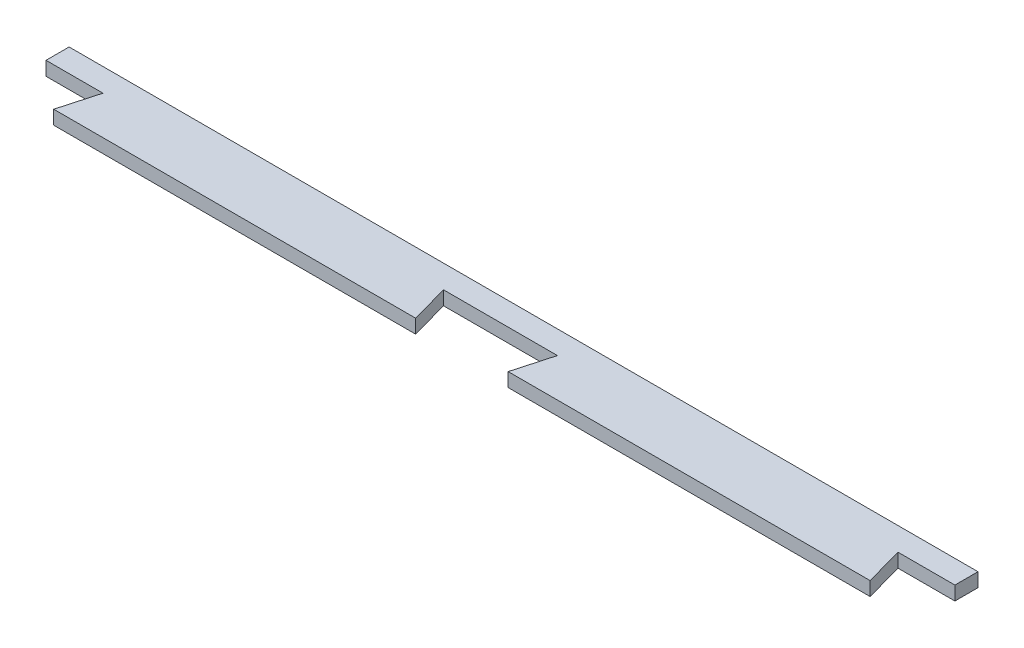
ISO-10303-21;
HEADER;
FILE_DESCRIPTION(('STEP AP214'),'2;1');
FILE_NAME('part.step','',(''),(''),'','','');
FILE_SCHEMA(('AUTOMOTIVE_DESIGN { 1 0 10303 214 1 1 1 1 }'));
ENDSEC;
DATA;
#1=APPLICATION_CONTEXT('core data for automotive mechanical design processes');
#2=APPLICATION_PROTOCOL_DEFINITION('international standard','automotive_design',2000,#1);
#3=PRODUCT_CONTEXT('',#1,'mechanical');
#4=PRODUCT('Part','Part','',(#3));
#5=PRODUCT_RELATED_PRODUCT_CATEGORY('part','',(#4));
#6=PRODUCT_DEFINITION_FORMATION('','',#4);
#7=PRODUCT_DEFINITION_CONTEXT('part definition',#1,'design');
#8=PRODUCT_DEFINITION('design','',#6,#7);
#9=PRODUCT_DEFINITION_SHAPE('','',#8);
#10=(LENGTH_UNIT() NAMED_UNIT(*) SI_UNIT(.MILLI.,.METRE.));
#11=(NAMED_UNIT(*) PLANE_ANGLE_UNIT() SI_UNIT($,.RADIAN.));
#12=(NAMED_UNIT(*) SI_UNIT($,.STERADIAN.) SOLID_ANGLE_UNIT());
#13=UNCERTAINTY_MEASURE_WITH_UNIT(LENGTH_MEASURE(1.E-05),#10,'distance_accuracy_value','');
#14=(GEOMETRIC_REPRESENTATION_CONTEXT(3) GLOBAL_UNCERTAINTY_ASSIGNED_CONTEXT((#13)) GLOBAL_UNIT_ASSIGNED_CONTEXT((#10,
#11,#12)) REPRESENTATION_CONTEXT('',''));
#15=CARTESIAN_POINT('',(0.,0.,0.));
#16=DIRECTION('',(0.,0.,1.));
#17=DIRECTION('',(1.,0.,0.));
#18=AXIS2_PLACEMENT_3D('',#15,#16,#17);
#19=CARTESIAN_POINT('',(0.,9.00000000000001,-24.9999999999999));
#20=DIRECTION('',(0.,0.,1.));
#21=DIRECTION('',(1.,0.,0.));
#22=AXIS2_PLACEMENT_3D('',#19,#20,#21);
#23=PLANE('',#22);
#24=DIRECTION('',(-1.,0.,0.));
#25=VECTOR('',#24,1.);
#26=CARTESIAN_POINT('',(0.,0.,-24.9999999999999));
#27=LINE('',#26,#25);
#28=CARTESIAN_POINT('',(590.,0.,-25.0000000000001));
#29=VERTEX_POINT('',#28);
#30=CARTESIAN_POINT('',(553.,0.,-25.0000000000001));
#31=VERTEX_POINT('',#30);
#32=EDGE_CURVE('E166',#29,#31,#27,.T.);
#33=ORIENTED_EDGE('',*,*,#32,.F.);
#34=DIRECTION('',(0.,-1.,0.));
#35=VECTOR('',#34,1.);
#36=CARTESIAN_POINT('',(590.,9.00000000000001,-25.0000000000001));
#37=LINE('',#36,#35);
#38=CARTESIAN_POINT('',(590.,9.00000000000001,-25.0000000000001));
#39=VERTEX_POINT('',#38);
#40=EDGE_CURVE('E11',#39,#29,#37,.T.);
#41=ORIENTED_EDGE('',*,*,#40,.F.);
#42=DIRECTION('',(-1.,0.,0.));
#43=VECTOR('',#42,1.);
#44=CARTESIAN_POINT('',(0.,9.00000000000001,-24.9999999999999));
#45=LINE('',#44,#43);
#46=CARTESIAN_POINT('',(553.,9.00000000000001,-25.0000000000001));
#47=VERTEX_POINT('',#46);
#48=EDGE_CURVE('E208',#39,#47,#45,.T.);
#49=ORIENTED_EDGE('',*,*,#48,.T.);
#50=DIRECTION('',(0.,-1.,0.));
#51=VECTOR('',#50,1.);
#52=CARTESIAN_POINT('',(553.,9.00000000000001,-25.0000000000001));
#53=LINE('',#52,#51);
#54=EDGE_CURVE('E59',#47,#31,#53,.T.);
#55=ORIENTED_EDGE('',*,*,#54,.T.);
#56=EDGE_LOOP('',(#33,#41,#49,#55));
#57=FACE_BOUND('',#56,.T.);
#58=ADVANCED_FACE('F42',(#57),#23,.T.);
#59=CARTESIAN_POINT('',(590.,9.00000000000001,0.));
#60=DIRECTION('',(-1.,0.,0.));
#61=DIRECTION('',(0.,0.,1.));
#62=AXIS2_PLACEMENT_3D('',#59,#60,#61);
#63=PLANE('',#62);
#64=DIRECTION('',(0.,0.,-1.));
#65=VECTOR('',#64,1.);
#66=CARTESIAN_POINT('',(590.,0.,0.));
#67=LINE('',#66,#65);
#68=CARTESIAN_POINT('',(590.,0.,-40.0000000000001));
#69=VERTEX_POINT('',#68);
#70=EDGE_CURVE('E169',#29,#69,#67,.T.);
#71=ORIENTED_EDGE('',*,*,#70,.T.);
#72=DIRECTION('',(0.,-1.,0.));
#73=VECTOR('',#72,1.);
#74=CARTESIAN_POINT('',(590.,9.00000000000001,-40.0000000000001));
#75=LINE('',#74,#73);
#76=CARTESIAN_POINT('',(590.,9.00000000000001,-40.0000000000001));
#77=VERTEX_POINT('',#76);
#78=EDGE_CURVE('E51',#77,#69,#75,.T.);
#79=ORIENTED_EDGE('',*,*,#78,.F.);
#80=DIRECTION('',(0.,0.,-1.));
#81=VECTOR('',#80,1.);
#82=CARTESIAN_POINT('',(590.,9.00000000000001,0.));
#83=LINE('',#82,#81);
#84=EDGE_CURVE('E257',#39,#77,#83,.T.);
#85=ORIENTED_EDGE('',*,*,#84,.F.);
#86=ORIENTED_EDGE('',*,*,#40,.T.);
#87=EDGE_LOOP('',(#71,#79,#85,#86));
#88=FACE_BOUND('',#87,.T.);
#89=ADVANCED_FACE('F245',(#88),#63,.F.);
#90=CARTESIAN_POINT('',(0.,9.00000000000001,-40.));
#91=DIRECTION('',(0.,0.,-1.));
#92=DIRECTION('',(-1.,0.,0.));
#93=AXIS2_PLACEMENT_3D('',#90,#91,#92);
#94=PLANE('',#93);
#95=DIRECTION('',(1.,0.,0.));
#96=VECTOR('',#95,1.);
#97=CARTESIAN_POINT('',(0.,0.,-40.));
#98=LINE('',#97,#96);
#99=CARTESIAN_POINT('',(0.,0.,-40.));
#100=VERTEX_POINT('',#99);
#101=EDGE_CURVE('E173',#100,#69,#98,.T.);
#102=ORIENTED_EDGE('',*,*,#101,.F.);
#103=DIRECTION('',(0.,-1.,0.));
#104=VECTOR('',#103,1.);
#105=CARTESIAN_POINT('',(0.,9.00000000000001,-40.));
#106=LINE('',#105,#104);
#107=CARTESIAN_POINT('',(0.,9.00000000000001,-40.));
#108=VERTEX_POINT('',#107);
#109=EDGE_CURVE('E232',#108,#100,#106,.T.);
#110=ORIENTED_EDGE('',*,*,#109,.F.);
#111=DIRECTION('',(1.,0.,0.));
#112=VECTOR('',#111,1.);
#113=CARTESIAN_POINT('',(0.,9.00000000000001,-40.));
#114=LINE('',#113,#112);
#115=EDGE_CURVE('E242',#108,#77,#114,.T.);
#116=ORIENTED_EDGE('',*,*,#115,.T.);
#117=ORIENTED_EDGE('',*,*,#78,.T.);
#118=EDGE_LOOP('',(#102,#110,#116,#117));
#119=FACE_BOUND('',#118,.T.);
#120=ADVANCED_FACE('F240',(#119),#94,.T.);
#121=CARTESIAN_POINT('',(0.,9.00000000000001,0.));
#122=DIRECTION('',(-1.,0.,0.));
#123=DIRECTION('',(0.,0.,1.));
#124=AXIS2_PLACEMENT_3D('',#121,#122,#123);
#125=PLANE('',#124);
#126=DIRECTION('',(0.,0.,-1.));
#127=VECTOR('',#126,1.);
#128=CARTESIAN_POINT('',(0.,0.,0.));
#129=LINE('',#128,#127);
#130=CARTESIAN_POINT('',(0.,0.,-25.));
#131=VERTEX_POINT('',#130);
#132=EDGE_CURVE('E177',#131,#100,#129,.T.);
#133=ORIENTED_EDGE('',*,*,#132,.F.);
#134=DIRECTION('',(0.,-1.,0.));
#135=VECTOR('',#134,1.);
#136=CARTESIAN_POINT('',(0.,9.00000000000001,-25.));
#137=LINE('',#136,#135);
#138=CARTESIAN_POINT('',(0.,9.00000000000001,-25.));
#139=VERTEX_POINT('',#138);
#140=EDGE_CURVE('E229',#139,#131,#137,.T.);
#141=ORIENTED_EDGE('',*,*,#140,.F.);
#142=DIRECTION('',(0.,0.,-1.));
#143=VECTOR('',#142,1.);
#144=CARTESIAN_POINT('',(0.,9.00000000000001,0.));
#145=LINE('',#144,#143);
#146=EDGE_CURVE('E256',#139,#108,#145,.T.);
#147=ORIENTED_EDGE('',*,*,#146,.T.);
#148=ORIENTED_EDGE('',*,*,#109,.T.);
#149=EDGE_LOOP('',(#133,#141,#147,#148));
#150=FACE_BOUND('',#149,.T.);
#151=ADVANCED_FACE('F252',(#150),#125,.T.);
#152=CARTESIAN_POINT('',(0.,9.00000000000001,-25.));
#153=DIRECTION('',(0.,0.,-1.));
#154=DIRECTION('',(-1.,0.,0.));
#155=AXIS2_PLACEMENT_3D('',#152,#153,#154);
#156=PLANE('',#155);
#157=DIRECTION('',(1.,0.,0.));
#158=VECTOR('',#157,1.);
#159=CARTESIAN_POINT('',(0.,0.,-25.));
#160=LINE('',#159,#158);
#161=CARTESIAN_POINT('',(37.,0.,-25.));
#162=VERTEX_POINT('',#161);
#163=EDGE_CURVE('E181',#131,#162,#160,.T.);
#164=ORIENTED_EDGE('',*,*,#163,.T.);
#165=DIRECTION('',(0.,-1.,0.));
#166=VECTOR('',#165,1.);
#167=CARTESIAN_POINT('',(37.,9.00000000000001,-25.));
#168=LINE('',#167,#166);
#169=CARTESIAN_POINT('',(37.,9.00000000000001,-25.));
#170=VERTEX_POINT('',#169);
#171=EDGE_CURVE('E225',#170,#162,#168,.T.);
#172=ORIENTED_EDGE('',*,*,#171,.F.);
#173=DIRECTION('',(1.,0.,0.));
#174=VECTOR('',#173,1.);
#175=CARTESIAN_POINT('',(0.,9.00000000000001,-25.));
#176=LINE('',#175,#174);
#177=EDGE_CURVE('E263',#139,#170,#176,.T.);
#178=ORIENTED_EDGE('',*,*,#177,.F.);
#179=ORIENTED_EDGE('',*,*,#140,.T.);
#180=EDGE_LOOP('',(#164,#172,#178,#179));
#181=FACE_BOUND('',#180,.T.);
#182=ADVANCED_FACE('F306',(#181),#156,.F.);
#183=CARTESIAN_POINT('',(27.8189910979229,9.00000000000001,7.7893175074184));
#184=DIRECTION('',(0.962964019714182,0.,0.269629925519971));
#185=DIRECTION('',(0.269629925519971,0.,-0.962964019714182));
#186=AXIS2_PLACEMENT_3D('',#183,#184,#185);
#187=PLANE('',#186);
#188=DIRECTION('',(-0.269629925519971,0.,0.962964019714182));
#189=VECTOR('',#188,1.);
#190=CARTESIAN_POINT('',(27.8189910979229,0.,7.7893175074184));
#191=LINE('',#190,#189);
#192=CARTESIAN_POINT('',(30.,0.,0.));
#193=VERTEX_POINT('',#192);
#194=EDGE_CURVE('E184',#162,#193,#191,.T.);
#195=ORIENTED_EDGE('',*,*,#194,.T.);
#196=DIRECTION('',(0.,-1.,0.));
#197=VECTOR('',#196,1.);
#198=CARTESIAN_POINT('',(30.,9.00000000000001,0.));
#199=LINE('',#198,#197);
#200=CARTESIAN_POINT('',(30.,9.00000000000001,0.));
#201=VERTEX_POINT('',#200);
#202=EDGE_CURVE('E221',#201,#193,#199,.T.);
#203=ORIENTED_EDGE('',*,*,#202,.F.);
#204=DIRECTION('',(-0.269629925519971,0.,0.962964019714182));
#205=VECTOR('',#204,1.);
#206=CARTESIAN_POINT('',(27.8189910979229,9.00000000000001,7.7893175074184));
#207=LINE('',#206,#205);
#208=EDGE_CURVE('E270',#170,#201,#207,.T.);
#209=ORIENTED_EDGE('',*,*,#208,.F.);
#210=ORIENTED_EDGE('',*,*,#171,.T.);
#211=EDGE_LOOP('',(#195,#203,#209,#210));
#212=FACE_BOUND('',#211,.T.);
#213=ADVANCED_FACE('F309',(#212),#187,.F.);
#214=CARTESIAN_POINT('',(0.,9.00000000000001,0.));
#215=DIRECTION('',(0.,0.,-1.));
#216=DIRECTION('',(-1.,0.,0.));
#217=AXIS2_PLACEMENT_3D('',#214,#215,#216);
#218=PLANE('',#217);
#219=DIRECTION('',(1.,0.,0.));
#220=VECTOR('',#219,1.);
#221=CARTESIAN_POINT('',(0.,0.,0.));
#222=LINE('',#221,#220);
#223=CARTESIAN_POINT('',(265.,0.,0.));
#224=VERTEX_POINT('',#223);
#225=EDGE_CURVE('E187',#193,#224,#222,.T.);
#226=ORIENTED_EDGE('',*,*,#225,.T.);
#227=DIRECTION('',(0.,-1.,0.));
#228=VECTOR('',#227,1.);
#229=CARTESIAN_POINT('',(265.,9.00000000000001,0.));
#230=LINE('',#229,#228);
#231=CARTESIAN_POINT('',(265.,9.00000000000001,0.));
#232=VERTEX_POINT('',#231);
#233=EDGE_CURVE('E218',#232,#224,#230,.T.);
#234=ORIENTED_EDGE('',*,*,#233,.F.);
#235=DIRECTION('',(1.,0.,0.));
#236=VECTOR('',#235,1.);
#237=CARTESIAN_POINT('',(0.,9.00000000000001,0.));
#238=LINE('',#237,#236);
#239=EDGE_CURVE('E273',#201,#232,#238,.T.);
#240=ORIENTED_EDGE('',*,*,#239,.F.);
#241=ORIENTED_EDGE('',*,*,#202,.T.);
#242=EDGE_LOOP('',(#226,#234,#240,#241));
#243=FACE_BOUND('',#242,.T.);
#244=ADVANCED_FACE('F313',(#243),#218,.F.);
#245=CARTESIAN_POINT('',(245.734421364985,9.00000000000001,-68.8056379821959));
#246=DIRECTION('',(0.962964019714182,0.,-0.269629925519971));
#247=DIRECTION('',(-0.269629925519971,0.,-0.962964019714182));
#248=AXIS2_PLACEMENT_3D('',#245,#246,#247);
#249=PLANE('',#248);
#250=DIRECTION('',(0.269629925519971,0.,0.962964019714182));
#251=VECTOR('',#250,1.);
#252=CARTESIAN_POINT('',(245.734421364985,0.,-68.8056379821959));
#253=LINE('',#252,#251);
#254=CARTESIAN_POINT('',(258.,0.,-25.));
#255=VERTEX_POINT('',#254);
#256=EDGE_CURVE('E191',#255,#224,#253,.T.);
#257=ORIENTED_EDGE('',*,*,#256,.F.);
#258=DIRECTION('',(0.,-1.,0.));
#259=VECTOR('',#258,1.);
#260=CARTESIAN_POINT('',(258.,9.00000000000001,-25.));
#261=LINE('',#260,#259);
#262=CARTESIAN_POINT('',(258.,9.00000000000001,-25.));
#263=VERTEX_POINT('',#262);
#264=EDGE_CURVE('E215',#263,#255,#261,.T.);
#265=ORIENTED_EDGE('',*,*,#264,.F.);
#266=DIRECTION('',(0.269629925519971,0.,0.962964019714182));
#267=VECTOR('',#266,1.);
#268=CARTESIAN_POINT('',(245.734421364985,9.00000000000001,-68.8056379821959));
#269=LINE('',#268,#267);
#270=EDGE_CURVE('E276',#263,#232,#269,.T.);
#271=ORIENTED_EDGE('',*,*,#270,.T.);
#272=ORIENTED_EDGE('',*,*,#233,.T.);
#273=EDGE_LOOP('',(#257,#265,#271,#272));
#274=FACE_BOUND('',#273,.T.);
#275=ADVANCED_FACE('F317',(#274),#249,.T.);
#276=CARTESIAN_POINT('',(0.,9.00000000000001,-25.));
#277=DIRECTION('',(0.,0.,1.));
#278=DIRECTION('',(1.,0.,0.));
#279=AXIS2_PLACEMENT_3D('',#276,#277,#278);
#280=PLANE('',#279);
#281=DIRECTION('',(-1.,0.,0.));
#282=VECTOR('',#281,1.);
#283=CARTESIAN_POINT('',(0.,0.,-25.));
#284=LINE('',#283,#282);
#285=CARTESIAN_POINT('',(332.,0.,-25.));
#286=VERTEX_POINT('',#285);
#287=EDGE_CURVE('E195',#286,#255,#284,.T.);
#288=ORIENTED_EDGE('',*,*,#287,.F.);
#289=DIRECTION('',(0.,-1.,0.));
#290=VECTOR('',#289,1.);
#291=CARTESIAN_POINT('',(332.,9.00000000000001,-25.));
#292=LINE('',#291,#290);
#293=CARTESIAN_POINT('',(332.,9.00000000000001,-25.));
#294=VERTEX_POINT('',#293);
#295=EDGE_CURVE('E155',#294,#286,#292,.T.);
#296=ORIENTED_EDGE('',*,*,#295,.F.);
#297=DIRECTION('',(-1.,0.,0.));
#298=VECTOR('',#297,1.);
#299=CARTESIAN_POINT('',(0.,9.00000000000001,-25.));
#300=LINE('',#299,#298);
#301=EDGE_CURVE('E143',#294,#263,#300,.T.);
#302=ORIENTED_EDGE('',*,*,#301,.T.);
#303=ORIENTED_EDGE('',*,*,#264,.T.);
#304=EDGE_LOOP('',(#288,#296,#302,#303));
#305=FACE_BOUND('',#304,.T.);
#306=ADVANCED_FACE('F283',(#305),#280,.T.);
#307=CARTESIAN_POINT('',(301.372403560831,9.00000000000001,84.3842729970327));
#308=DIRECTION('',(0.962964019714182,0.,0.269629925519971));
#309=DIRECTION('',(0.269629925519971,0.,-0.962964019714182));
#310=AXIS2_PLACEMENT_3D('',#307,#308,#309);
#311=PLANE('',#310);
#312=DIRECTION('',(-0.269629925519971,0.,0.962964019714182));
#313=VECTOR('',#312,1.);
#314=CARTESIAN_POINT('',(301.372403560831,0.,84.3842729970327));
#315=LINE('',#314,#313);
#316=CARTESIAN_POINT('',(325.,0.,0.));
#317=VERTEX_POINT('',#316);
#318=EDGE_CURVE('E151',#286,#317,#315,.T.);
#319=ORIENTED_EDGE('',*,*,#318,.T.);
#320=DIRECTION('',(0.,-1.,0.));
#321=VECTOR('',#320,1.);
#322=CARTESIAN_POINT('',(325.,9.00000000000001,0.));
#323=LINE('',#322,#321);
#324=CARTESIAN_POINT('',(325.,9.00000000000001,0.));
#325=VERTEX_POINT('',#324);
#326=EDGE_CURVE('E148',#325,#317,#323,.T.);
#327=ORIENTED_EDGE('',*,*,#326,.F.);
#328=DIRECTION('',(-0.269629925519971,0.,0.962964019714182));
#329=VECTOR('',#328,1.);
#330=CARTESIAN_POINT('',(301.372403560831,9.00000000000001,84.3842729970327));
#331=LINE('',#330,#329);
#332=EDGE_CURVE('E134',#294,#325,#331,.T.);
#333=ORIENTED_EDGE('',*,*,#332,.F.);
#334=ORIENTED_EDGE('',*,*,#295,.T.);
#335=EDGE_LOOP('',(#319,#327,#333,#334));
#336=FACE_BOUND('',#335,.T.);
#337=ADVANCED_FACE('F149',(#336),#311,.F.);
#338=CARTESIAN_POINT('',(0.,9.00000000000001,0.));
#339=DIRECTION('',(0.,0.,-1.));
#340=DIRECTION('',(-1.,0.,0.));
#341=AXIS2_PLACEMENT_3D('',#338,#339,#340);
#342=PLANE('',#341);
#343=DIRECTION('',(1.,0.,0.));
#344=VECTOR('',#343,1.);
#345=CARTESIAN_POINT('',(0.,0.,0.));
#346=LINE('',#345,#344);
#347=CARTESIAN_POINT('',(560.,0.,0.));
#348=VERTEX_POINT('',#347);
#349=EDGE_CURVE('E201',#317,#348,#346,.T.);
#350=ORIENTED_EDGE('',*,*,#349,.T.);
#351=DIRECTION('',(0.,-1.,0.));
#352=VECTOR('',#351,1.);
#353=CARTESIAN_POINT('',(560.,9.00000000000001,0.));
#354=LINE('',#353,#352);
#355=CARTESIAN_POINT('',(560.,9.00000000000001,0.));
#356=VERTEX_POINT('',#355);
#357=EDGE_CURVE('E97',#356,#348,#354,.T.);
#358=ORIENTED_EDGE('',*,*,#357,.F.);
#359=DIRECTION('',(1.,0.,0.));
#360=VECTOR('',#359,1.);
#361=CARTESIAN_POINT('',(0.,9.00000000000001,0.));
#362=LINE('',#361,#360);
#363=EDGE_CURVE('E140',#325,#356,#362,.T.);
#364=ORIENTED_EDGE('',*,*,#363,.F.);
#365=ORIENTED_EDGE('',*,*,#326,.T.);
#366=EDGE_LOOP('',(#350,#358,#364,#365));
#367=FACE_BOUND('',#366,.T.);
#368=ADVANCED_FACE('F157',(#367),#342,.F.);
#369=CARTESIAN_POINT('',(519.287833827893,9.00000000000001,-145.40059347181));
#370=DIRECTION('',(0.962964019714182,0.,-0.269629925519971));
#371=DIRECTION('',(-0.269629925519971,0.,-0.962964019714182));
#372=AXIS2_PLACEMENT_3D('',#369,#370,#371);
#373=PLANE('',#372);
#374=DIRECTION('',(0.269629925519971,0.,0.962964019714182));
#375=VECTOR('',#374,1.);
#376=CARTESIAN_POINT('',(519.287833827893,0.,-145.40059347181));
#377=LINE('',#376,#375);
#378=EDGE_CURVE('E204',#31,#348,#377,.T.);
#379=ORIENTED_EDGE('',*,*,#378,.F.);
#380=ORIENTED_EDGE('',*,*,#54,.F.);
#381=DIRECTION('',(0.269629925519971,0.,0.962964019714182));
#382=VECTOR('',#381,1.);
#383=CARTESIAN_POINT('',(519.287833827893,9.00000000000001,-145.40059347181));
#384=LINE('',#383,#382);
#385=EDGE_CURVE('E159',#47,#356,#384,.T.);
#386=ORIENTED_EDGE('',*,*,#385,.T.);
#387=ORIENTED_EDGE('',*,*,#357,.T.);
#388=EDGE_LOOP('',(#379,#380,#386,#387));
#389=FACE_BOUND('',#388,.T.);
#390=ADVANCED_FACE('F285',(#389),#373,.T.);
#391=CARTESIAN_POINT('',(0.,9.00000000000001,0.));
#392=DIRECTION('',(0.,1.,0.));
#393=DIRECTION('',(0.,0.,1.));
#394=AXIS2_PLACEMENT_3D('',#391,#392,#393);
#395=PLANE('',#394);
#396=ORIENTED_EDGE('',*,*,#48,.F.);
#397=ORIENTED_EDGE('',*,*,#84,.T.);
#398=ORIENTED_EDGE('',*,*,#115,.F.);
#399=ORIENTED_EDGE('',*,*,#146,.F.);
#400=ORIENTED_EDGE('',*,*,#177,.T.);
#401=ORIENTED_EDGE('',*,*,#208,.T.);
#402=ORIENTED_EDGE('',*,*,#239,.T.);
#403=ORIENTED_EDGE('',*,*,#270,.F.);
#404=ORIENTED_EDGE('',*,*,#301,.F.);
#405=ORIENTED_EDGE('',*,*,#332,.T.);
#406=ORIENTED_EDGE('',*,*,#363,.T.);
#407=ORIENTED_EDGE('',*,*,#385,.F.);
#408=EDGE_LOOP('',(#396,#397,#398,#399,#400,#401,#402,#403,#404,#405,#406,#407));
#409=FACE_BOUND('',#408,.T.);
#410=ADVANCED_FACE('F137',(#409),#395,.T.);
#411=CARTESIAN_POINT('',(0.,0.,0.));
#412=DIRECTION('',(0.,1.,0.));
#413=DIRECTION('',(0.,0.,1.));
#414=AXIS2_PLACEMENT_3D('',#411,#412,#413);
#415=PLANE('',#414);
#416=ORIENTED_EDGE('',*,*,#32,.T.);
#417=ORIENTED_EDGE('',*,*,#378,.T.);
#418=ORIENTED_EDGE('',*,*,#349,.F.);
#419=ORIENTED_EDGE('',*,*,#318,.F.);
#420=ORIENTED_EDGE('',*,*,#287,.T.);
#421=ORIENTED_EDGE('',*,*,#256,.T.);
#422=ORIENTED_EDGE('',*,*,#225,.F.);
#423=ORIENTED_EDGE('',*,*,#194,.F.);
#424=ORIENTED_EDGE('',*,*,#163,.F.);
#425=ORIENTED_EDGE('',*,*,#132,.T.);
#426=ORIENTED_EDGE('',*,*,#101,.T.);
#427=ORIENTED_EDGE('',*,*,#70,.F.);
#428=EDGE_LOOP('',(#416,#417,#418,#419,#420,#421,#422,#423,#424,#425,#426,#427));
#429=FACE_BOUND('',#428,.T.);
#430=ADVANCED_FACE('F247',(#429),#415,.F.);
#431=CLOSED_SHELL('',(#58,#89,#120,#151,#182,#213,#244,#275,#306,#337,#368,#390,#410,#430));
#432=MANIFOLD_SOLID_BREP('B2',#431);
#433=ADVANCED_BREP_SHAPE_REPRESENTATION('',(#18,#432),#14);
#434=SHAPE_DEFINITION_REPRESENTATION(#9,#433);
ENDSEC;
END-ISO-10303-21;
